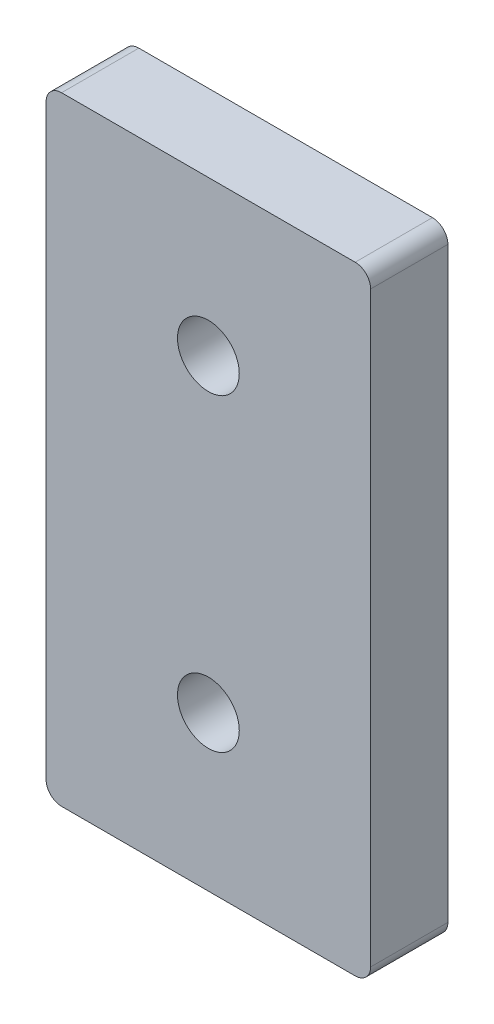
ISO-10303-21;
HEADER;
FILE_DESCRIPTION(('STEP AP214'),'2;1');
FILE_NAME('part.step','',(''),(''),'','','');
FILE_SCHEMA(('AUTOMOTIVE_DESIGN { 1 0 10303 214 1 1 1 1 }'));
ENDSEC;
DATA;
#1=APPLICATION_CONTEXT('core data for automotive mechanical design processes');
#2=APPLICATION_PROTOCOL_DEFINITION('international standard','automotive_design',2000,#1);
#3=PRODUCT_CONTEXT('',#1,'mechanical');
#4=PRODUCT('Part','Part','',(#3));
#5=PRODUCT_RELATED_PRODUCT_CATEGORY('part','',(#4));
#6=PRODUCT_DEFINITION_FORMATION('','',#4);
#7=PRODUCT_DEFINITION_CONTEXT('part definition',#1,'design');
#8=PRODUCT_DEFINITION('design','',#6,#7);
#9=PRODUCT_DEFINITION_SHAPE('','',#8);
#10=(LENGTH_UNIT() NAMED_UNIT(*) SI_UNIT(.MILLI.,.METRE.));
#11=(NAMED_UNIT(*) PLANE_ANGLE_UNIT() SI_UNIT($,.RADIAN.));
#12=(NAMED_UNIT(*) SI_UNIT($,.STERADIAN.) SOLID_ANGLE_UNIT());
#13=UNCERTAINTY_MEASURE_WITH_UNIT(LENGTH_MEASURE(1.E-05),#10,'distance_accuracy_value','');
#14=(GEOMETRIC_REPRESENTATION_CONTEXT(3) GLOBAL_UNCERTAINTY_ASSIGNED_CONTEXT((#13)) GLOBAL_UNIT_ASSIGNED_CONTEXT((#10,
#11,#12)) REPRESENTATION_CONTEXT('',''));
#15=CARTESIAN_POINT('',(0.,0.,0.));
#16=DIRECTION('',(0.,0.,1.));
#17=DIRECTION('',(1.,0.,0.));
#18=AXIS2_PLACEMENT_3D('',#15,#16,#17);
#19=CARTESIAN_POINT('',(0.,0.,5.));
#20=DIRECTION('',(0.,0.,-1.));
#21=DIRECTION('',(-1.,0.,0.));
#22=AXIS2_PLACEMENT_3D('',#19,#20,#21);
#23=PLANE('',#22);
#24=DIRECTION('',(1.,0.,0.));
#25=VECTOR('',#24,1.);
#26=CARTESIAN_POINT('',(0.,0.,5.));
#27=LINE('',#26,#25);
#28=CARTESIAN_POINT('',(1.,0.,5.));
#29=VERTEX_POINT('',#28);
#30=CARTESIAN_POINT('',(20.,0.,5.));
#31=VERTEX_POINT('',#30);
#32=EDGE_CURVE('E171',#29,#31,#27,.T.);
#33=ORIENTED_EDGE('',*,*,#32,.T.);
#34=CARTESIAN_POINT('',(20.,1.,5.));
#35=DIRECTION('',(0.,0.,-1.));
#36=DIRECTION('',(-1.,0.,0.));
#37=AXIS2_PLACEMENT_3D('',#34,#35,#36);
#38=CIRCLE('',#37,1.);
#39=CARTESIAN_POINT('',(21.,1.,5.));
#40=VERTEX_POINT('',#39);
#41=EDGE_CURVE('E149',#31,#40,#38,.F.);
#42=ORIENTED_EDGE('',*,*,#41,.T.);
#43=DIRECTION('',(0.,1.,0.));
#44=VECTOR('',#43,1.);
#45=CARTESIAN_POINT('',(21.,0.,5.));
#46=LINE('',#45,#44);
#47=CARTESIAN_POINT('',(21.,39.,5.));
#48=VERTEX_POINT('',#47);
#49=EDGE_CURVE('E119',#40,#48,#46,.T.);
#50=ORIENTED_EDGE('',*,*,#49,.T.);
#51=CARTESIAN_POINT('',(20.,39.,5.));
#52=DIRECTION('',(0.,0.,-1.));
#53=DIRECTION('',(-1.,0.,0.));
#54=AXIS2_PLACEMENT_3D('',#51,#52,#53);
#55=CIRCLE('',#54,1.);
#56=CARTESIAN_POINT('',(20.,40.,5.));
#57=VERTEX_POINT('',#56);
#58=EDGE_CURVE('E55',#48,#57,#55,.F.);
#59=ORIENTED_EDGE('',*,*,#58,.T.);
#60=DIRECTION('',(-1.,0.,0.));
#61=VECTOR('',#60,1.);
#62=CARTESIAN_POINT('',(0.,40.,5.));
#63=LINE('',#62,#61);
#64=CARTESIAN_POINT('',(1.,40.,5.));
#65=VERTEX_POINT('',#64);
#66=EDGE_CURVE('E135',#57,#65,#63,.T.);
#67=ORIENTED_EDGE('',*,*,#66,.T.);
#68=CARTESIAN_POINT('',(1.,39.,5.));
#69=DIRECTION('',(0.,0.,-1.));
#70=DIRECTION('',(-1.,0.,0.));
#71=AXIS2_PLACEMENT_3D('',#68,#69,#70);
#72=CIRCLE('',#71,1.);
#73=CARTESIAN_POINT('',(0.,39.,5.));
#74=VERTEX_POINT('',#73);
#75=EDGE_CURVE('E145',#65,#74,#72,.F.);
#76=ORIENTED_EDGE('',*,*,#75,.T.);
#77=DIRECTION('',(0.,-1.,0.));
#78=VECTOR('',#77,1.);
#79=CARTESIAN_POINT('',(0.,0.,5.));
#80=LINE('',#79,#78);
#81=CARTESIAN_POINT('',(0.,1.,5.));
#82=VERTEX_POINT('',#81);
#83=EDGE_CURVE('E129',#74,#82,#80,.T.);
#84=ORIENTED_EDGE('',*,*,#83,.T.);
#85=CARTESIAN_POINT('',(1.,1.,5.));
#86=DIRECTION('',(0.,0.,-1.));
#87=DIRECTION('',(-1.,0.,0.));
#88=AXIS2_PLACEMENT_3D('',#85,#86,#87);
#89=CIRCLE('',#88,1.);
#90=EDGE_CURVE('E147',#82,#29,#89,.F.);
#91=ORIENTED_EDGE('',*,*,#90,.T.);
#92=EDGE_LOOP('',(#33,#42,#50,#59,#67,#76,#84,#91));
#93=FACE_BOUND('',#92,.T.);
#94=CARTESIAN_POINT('',(10.5,10.,5.));
#95=DIRECTION('',(0.,0.,1.));
#96=DIRECTION('',(1.,0.,0.));
#97=AXIS2_PLACEMENT_3D('',#94,#95,#96);
#98=CIRCLE('',#97,2.);
#99=CARTESIAN_POINT('',(12.5,10.,5.));
#100=VERTEX_POINT('',#99);
#101=EDGE_CURVE('E180',#100,#100,#98,.T.);
#102=ORIENTED_EDGE('',*,*,#101,.F.);
#103=EDGE_LOOP('',(#102));
#104=FACE_BOUND('',#103,.T.);
#105=CARTESIAN_POINT('',(10.5,30.,5.));
#106=DIRECTION('',(0.,0.,1.));
#107=DIRECTION('',(1.,0.,0.));
#108=AXIS2_PLACEMENT_3D('',#105,#106,#107);
#109=CIRCLE('',#108,2.);
#110=CARTESIAN_POINT('',(12.5,30.,5.));
#111=VERTEX_POINT('',#110);
#112=EDGE_CURVE('E185',#111,#111,#109,.T.);
#113=ORIENTED_EDGE('',*,*,#112,.F.);
#114=EDGE_LOOP('',(#113));
#115=FACE_BOUND('',#114,.T.);
#116=ADVANCED_FACE('F35',(#93,#104,#115),#23,.F.);
#117=CARTESIAN_POINT('',(0.,0.,0.));
#118=DIRECTION('',(0.,0.,-1.));
#119=DIRECTION('',(-1.,0.,0.));
#120=AXIS2_PLACEMENT_3D('',#117,#118,#119);
#121=PLANE('',#120);
#122=CARTESIAN_POINT('',(10.5,10.,0.));
#123=DIRECTION('',(0.,0.,1.));
#124=DIRECTION('',(1.,0.,0.));
#125=AXIS2_PLACEMENT_3D('',#122,#123,#124);
#126=CIRCLE('',#125,2.);
#127=CARTESIAN_POINT('',(12.5,10.,0.));
#128=VERTEX_POINT('',#127);
#129=EDGE_CURVE('E176',#128,#128,#126,.T.);
#130=ORIENTED_EDGE('',*,*,#129,.T.);
#131=EDGE_LOOP('',(#130));
#132=FACE_BOUND('',#131,.T.);
#133=DIRECTION('',(0.,1.,0.));
#134=VECTOR('',#133,1.);
#135=CARTESIAN_POINT('',(21.,0.,0.));
#136=LINE('',#135,#134);
#137=CARTESIAN_POINT('',(21.,1.,0.));
#138=VERTEX_POINT('',#137);
#139=CARTESIAN_POINT('',(21.,39.,0.));
#140=VERTEX_POINT('',#139);
#141=EDGE_CURVE('E117',#138,#140,#136,.T.);
#142=ORIENTED_EDGE('',*,*,#141,.F.);
#143=CARTESIAN_POINT('',(20.,1.,0.));
#144=DIRECTION('',(0.,0.,-1.));
#145=DIRECTION('',(-1.,0.,0.));
#146=AXIS2_PLACEMENT_3D('',#143,#144,#145);
#147=CIRCLE('',#146,1.);
#148=CARTESIAN_POINT('',(20.,0.,0.));
#149=VERTEX_POINT('',#148);
#150=EDGE_CURVE('E100',#138,#149,#147,.T.);
#151=ORIENTED_EDGE('',*,*,#150,.T.);
#152=DIRECTION('',(1.,0.,0.));
#153=VECTOR('',#152,1.);
#154=CARTESIAN_POINT('',(0.,0.,0.));
#155=LINE('',#154,#153);
#156=CARTESIAN_POINT('',(1.,0.,0.));
#157=VERTEX_POINT('',#156);
#158=EDGE_CURVE('E127',#157,#149,#155,.T.);
#159=ORIENTED_EDGE('',*,*,#158,.F.);
#160=CARTESIAN_POINT('',(1.,1.,0.));
#161=DIRECTION('',(0.,0.,-1.));
#162=DIRECTION('',(-1.,0.,0.));
#163=AXIS2_PLACEMENT_3D('',#160,#161,#162);
#164=CIRCLE('',#163,1.);
#165=CARTESIAN_POINT('',(0.,1.,0.));
#166=VERTEX_POINT('',#165);
#167=EDGE_CURVE('E111',#157,#166,#164,.T.);
#168=ORIENTED_EDGE('',*,*,#167,.T.);
#169=DIRECTION('',(0.,-1.,0.));
#170=VECTOR('',#169,1.);
#171=CARTESIAN_POINT('',(0.,0.,0.));
#172=LINE('',#171,#170);
#173=CARTESIAN_POINT('',(0.,39.,0.));
#174=VERTEX_POINT('',#173);
#175=EDGE_CURVE('E131',#174,#166,#172,.T.);
#176=ORIENTED_EDGE('',*,*,#175,.F.);
#177=CARTESIAN_POINT('',(1.,39.,0.));
#178=DIRECTION('',(0.,0.,-1.));
#179=DIRECTION('',(-1.,0.,0.));
#180=AXIS2_PLACEMENT_3D('',#177,#178,#179);
#181=CIRCLE('',#180,1.);
#182=CARTESIAN_POINT('',(1.,40.,0.));
#183=VERTEX_POINT('',#182);
#184=EDGE_CURVE('E138',#174,#183,#181,.T.);
#185=ORIENTED_EDGE('',*,*,#184,.T.);
#186=DIRECTION('',(-1.,0.,0.));
#187=VECTOR('',#186,1.);
#188=CARTESIAN_POINT('',(0.,40.,0.));
#189=LINE('',#188,#187);
#190=CARTESIAN_POINT('',(20.,40.,0.));
#191=VERTEX_POINT('',#190);
#192=EDGE_CURVE('E126',#191,#183,#189,.T.);
#193=ORIENTED_EDGE('',*,*,#192,.F.);
#194=CARTESIAN_POINT('',(20.,39.,0.));
#195=DIRECTION('',(0.,0.,-1.));
#196=DIRECTION('',(-1.,0.,0.));
#197=AXIS2_PLACEMENT_3D('',#194,#195,#196);
#198=CIRCLE('',#197,1.);
#199=EDGE_CURVE('E120',#191,#140,#198,.T.);
#200=ORIENTED_EDGE('',*,*,#199,.T.);
#201=EDGE_LOOP('',(#142,#151,#159,#168,#176,#185,#193,#200));
#202=FACE_BOUND('',#201,.T.);
#203=CARTESIAN_POINT('',(10.5,30.,0.));
#204=DIRECTION('',(0.,0.,1.));
#205=DIRECTION('',(1.,0.,0.));
#206=AXIS2_PLACEMENT_3D('',#203,#204,#205);
#207=CIRCLE('',#206,2.);
#208=CARTESIAN_POINT('',(12.5,30.,0.));
#209=VERTEX_POINT('',#208);
#210=EDGE_CURVE('E187',#209,#209,#207,.T.);
#211=ORIENTED_EDGE('',*,*,#210,.T.);
#212=EDGE_LOOP('',(#211));
#213=FACE_BOUND('',#212,.T.);
#214=ADVANCED_FACE('F123',(#132,#202,#213),#121,.T.);
#215=CARTESIAN_POINT('',(0.,0.,5.));
#216=DIRECTION('',(1.,0.,0.));
#217=DIRECTION('',(0.,0.,-1.));
#218=AXIS2_PLACEMENT_3D('',#215,#216,#217);
#219=PLANE('',#218);
#220=ORIENTED_EDGE('',*,*,#175,.T.);
#221=DIRECTION('',(0.,0.,-1.));
#222=VECTOR('',#221,1.);
#223=CARTESIAN_POINT('',(0.,1.,5.));
#224=LINE('',#223,#222);
#225=EDGE_CURVE('E154',#166,#82,#224,.F.);
#226=ORIENTED_EDGE('',*,*,#225,.T.);
#227=ORIENTED_EDGE('',*,*,#83,.F.);
#228=DIRECTION('',(0.,0.,-1.));
#229=VECTOR('',#228,1.);
#230=CARTESIAN_POINT('',(0.,39.,5.));
#231=LINE('',#230,#229);
#232=EDGE_CURVE('E151',#74,#174,#231,.T.);
#233=ORIENTED_EDGE('',*,*,#232,.T.);
#234=EDGE_LOOP('',(#220,#226,#227,#233));
#235=FACE_BOUND('',#234,.T.);
#236=ADVANCED_FACE('F167',(#235),#219,.F.);
#237=CARTESIAN_POINT('',(0.,0.,5.));
#238=DIRECTION('',(0.,1.,0.));
#239=DIRECTION('',(0.,0.,1.));
#240=AXIS2_PLACEMENT_3D('',#237,#238,#239);
#241=PLANE('',#240);
#242=ORIENTED_EDGE('',*,*,#158,.T.);
#243=DIRECTION('',(0.,0.,-1.));
#244=VECTOR('',#243,1.);
#245=CARTESIAN_POINT('',(20.,0.,5.));
#246=LINE('',#245,#244);
#247=EDGE_CURVE('E105',#149,#31,#246,.F.);
#248=ORIENTED_EDGE('',*,*,#247,.T.);
#249=ORIENTED_EDGE('',*,*,#32,.F.);
#250=DIRECTION('',(0.,0.,-1.));
#251=VECTOR('',#250,1.);
#252=CARTESIAN_POINT('',(1.,0.,5.));
#253=LINE('',#252,#251);
#254=EDGE_CURVE('E110',#29,#157,#253,.T.);
#255=ORIENTED_EDGE('',*,*,#254,.T.);
#256=EDGE_LOOP('',(#242,#248,#249,#255));
#257=FACE_BOUND('',#256,.T.);
#258=ADVANCED_FACE('F212',(#257),#241,.F.);
#259=CARTESIAN_POINT('',(21.,0.,5.));
#260=DIRECTION('',(-1.,0.,0.));
#261=DIRECTION('',(0.,0.,1.));
#262=AXIS2_PLACEMENT_3D('',#259,#260,#261);
#263=PLANE('',#262);
#264=ORIENTED_EDGE('',*,*,#49,.F.);
#265=DIRECTION('',(0.,0.,-1.));
#266=VECTOR('',#265,1.);
#267=CARTESIAN_POINT('',(21.,1.,5.));
#268=LINE('',#267,#266);
#269=EDGE_CURVE('E104',#40,#138,#268,.T.);
#270=ORIENTED_EDGE('',*,*,#269,.T.);
#271=ORIENTED_EDGE('',*,*,#141,.T.);
#272=DIRECTION('',(0.,0.,-1.));
#273=VECTOR('',#272,1.);
#274=CARTESIAN_POINT('',(21.,39.,5.));
#275=LINE('',#274,#273);
#276=EDGE_CURVE('E121',#140,#48,#275,.F.);
#277=ORIENTED_EDGE('',*,*,#276,.T.);
#278=EDGE_LOOP('',(#264,#270,#271,#277));
#279=FACE_BOUND('',#278,.T.);
#280=ADVANCED_FACE('F116',(#279),#263,.F.);
#281=CARTESIAN_POINT('',(0.,40.,5.));
#282=DIRECTION('',(0.,-1.,0.));
#283=DIRECTION('',(0.,0.,-1.));
#284=AXIS2_PLACEMENT_3D('',#281,#282,#283);
#285=PLANE('',#284);
#286=ORIENTED_EDGE('',*,*,#192,.T.);
#287=DIRECTION('',(0.,0.,-1.));
#288=VECTOR('',#287,1.);
#289=CARTESIAN_POINT('',(1.,40.,5.));
#290=LINE('',#289,#288);
#291=EDGE_CURVE('E11',#183,#65,#290,.F.);
#292=ORIENTED_EDGE('',*,*,#291,.T.);
#293=ORIENTED_EDGE('',*,*,#66,.F.);
#294=DIRECTION('',(0.,0.,-1.));
#295=VECTOR('',#294,1.);
#296=CARTESIAN_POINT('',(20.,40.,5.));
#297=LINE('',#296,#295);
#298=EDGE_CURVE('E43',#57,#191,#297,.T.);
#299=ORIENTED_EDGE('',*,*,#298,.T.);
#300=EDGE_LOOP('',(#286,#292,#293,#299));
#301=FACE_BOUND('',#300,.T.);
#302=ADVANCED_FACE('F157',(#301),#285,.F.);
#303=CARTESIAN_POINT('',(10.5,10.,5.));
#304=DIRECTION('',(0.,0.,-1.));
#305=DIRECTION('',(-1.,0.,0.));
#306=AXIS2_PLACEMENT_3D('',#303,#304,#305);
#307=CYLINDRICAL_SURFACE('',#306,2.);
#308=ORIENTED_EDGE('',*,*,#101,.T.);
#309=EDGE_LOOP('',(#308));
#310=FACE_BOUND('',#309,.T.);
#311=ORIENTED_EDGE('',*,*,#129,.F.);
#312=EDGE_LOOP('',(#311));
#313=FACE_BOUND('',#312,.T.);
#314=ADVANCED_FACE('F205',(#310,#313),#307,.F.);
#315=CARTESIAN_POINT('',(10.5,30.,5.));
#316=DIRECTION('',(0.,0.,-1.));
#317=DIRECTION('',(-1.,0.,0.));
#318=AXIS2_PLACEMENT_3D('',#315,#316,#317);
#319=CYLINDRICAL_SURFACE('',#318,2.);
#320=ORIENTED_EDGE('',*,*,#112,.T.);
#321=EDGE_LOOP('',(#320));
#322=FACE_BOUND('',#321,.T.);
#323=ORIENTED_EDGE('',*,*,#210,.F.);
#324=EDGE_LOOP('',(#323));
#325=FACE_BOUND('',#324,.T.);
#326=ADVANCED_FACE('F193',(#322,#325),#319,.F.);
#327=CARTESIAN_POINT('',(20.,1.,5.));
#328=DIRECTION('',(0.,0.,-1.));
#329=DIRECTION('',(-1.,0.,0.));
#330=AXIS2_PLACEMENT_3D('',#327,#328,#329);
#331=CYLINDRICAL_SURFACE('',#330,1.);
#332=ORIENTED_EDGE('',*,*,#41,.F.);
#333=ORIENTED_EDGE('',*,*,#247,.F.);
#334=ORIENTED_EDGE('',*,*,#150,.F.);
#335=ORIENTED_EDGE('',*,*,#269,.F.);
#336=EDGE_LOOP('',(#332,#333,#334,#335));
#337=FACE_BOUND('',#336,.T.);
#338=ADVANCED_FACE('F103',(#337),#331,.T.);
#339=CARTESIAN_POINT('',(1.,1.,5.));
#340=DIRECTION('',(0.,0.,-1.));
#341=DIRECTION('',(-1.,0.,0.));
#342=AXIS2_PLACEMENT_3D('',#339,#340,#341);
#343=CYLINDRICAL_SURFACE('',#342,1.);
#344=ORIENTED_EDGE('',*,*,#90,.F.);
#345=ORIENTED_EDGE('',*,*,#225,.F.);
#346=ORIENTED_EDGE('',*,*,#167,.F.);
#347=ORIENTED_EDGE('',*,*,#254,.F.);
#348=EDGE_LOOP('',(#344,#345,#346,#347));
#349=FACE_BOUND('',#348,.T.);
#350=ADVANCED_FACE('F220',(#349),#343,.T.);
#351=CARTESIAN_POINT('',(1.,39.,5.));
#352=DIRECTION('',(0.,0.,-1.));
#353=DIRECTION('',(-1.,0.,0.));
#354=AXIS2_PLACEMENT_3D('',#351,#352,#353);
#355=CYLINDRICAL_SURFACE('',#354,1.);
#356=ORIENTED_EDGE('',*,*,#75,.F.);
#357=ORIENTED_EDGE('',*,*,#291,.F.);
#358=ORIENTED_EDGE('',*,*,#184,.F.);
#359=ORIENTED_EDGE('',*,*,#232,.F.);
#360=EDGE_LOOP('',(#356,#357,#358,#359));
#361=FACE_BOUND('',#360,.T.);
#362=ADVANCED_FACE('F164',(#361),#355,.T.);
#363=CARTESIAN_POINT('',(20.,39.,5.));
#364=DIRECTION('',(0.,0.,-1.));
#365=DIRECTION('',(-1.,0.,0.));
#366=AXIS2_PLACEMENT_3D('',#363,#364,#365);
#367=CYLINDRICAL_SURFACE('',#366,1.);
#368=ORIENTED_EDGE('',*,*,#58,.F.);
#369=ORIENTED_EDGE('',*,*,#276,.F.);
#370=ORIENTED_EDGE('',*,*,#199,.F.);
#371=ORIENTED_EDGE('',*,*,#298,.F.);
#372=EDGE_LOOP('',(#368,#369,#370,#371));
#373=FACE_BOUND('',#372,.T.);
#374=ADVANCED_FACE('F37',(#373),#367,.T.);
#375=CLOSED_SHELL('',(#116,#214,#236,#258,#280,#302,#314,#326,#338,#350,#362,#374));
#376=MANIFOLD_SOLID_BREP('B2',#375);
#377=ADVANCED_BREP_SHAPE_REPRESENTATION('',(#18,#376),#14);
#378=SHAPE_DEFINITION_REPRESENTATION(#9,#377);
ENDSEC;
END-ISO-10303-21;
